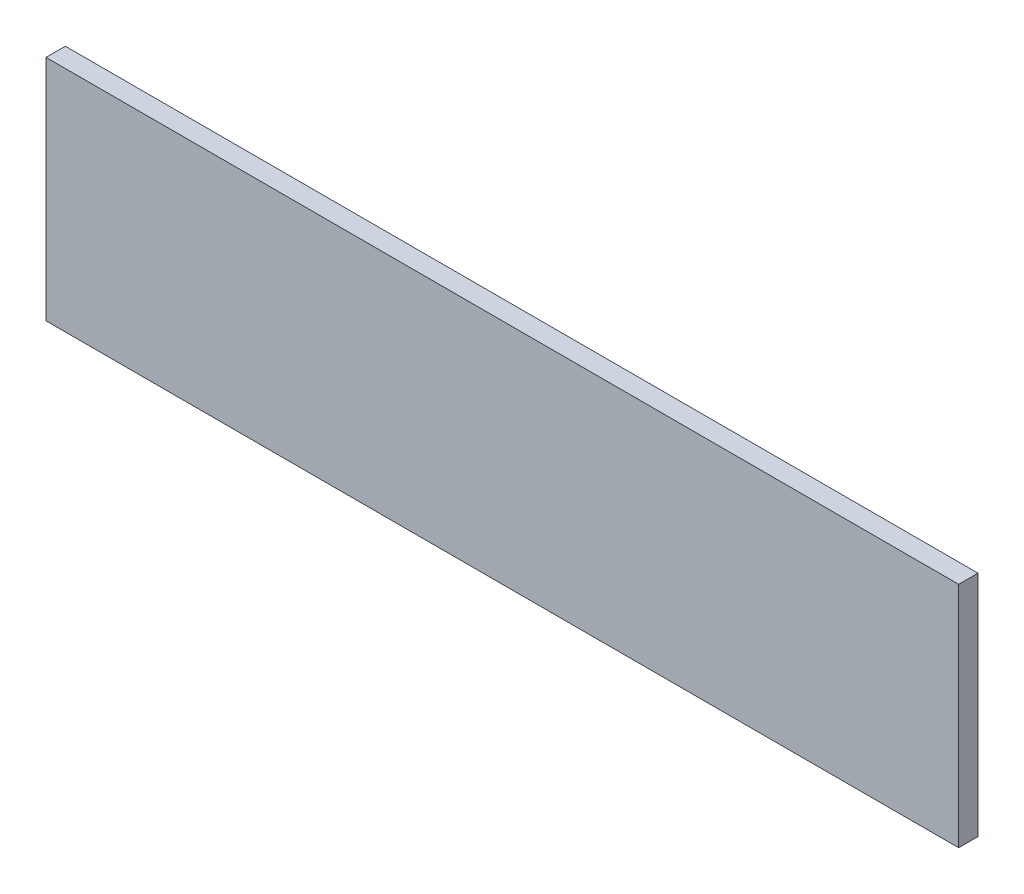
ISO-10303-21;
HEADER;
FILE_DESCRIPTION(('STEP AP214'),'2;1');
FILE_NAME('part.step','',(''),(''),'','','');
FILE_SCHEMA(('AUTOMOTIVE_DESIGN { 1 0 10303 214 1 1 1 1 }'));
ENDSEC;
DATA;
#1=APPLICATION_CONTEXT('core data for automotive mechanical design processes');
#2=APPLICATION_PROTOCOL_DEFINITION('international standard','automotive_design',2000,#1);
#3=PRODUCT_CONTEXT('',#1,'mechanical');
#4=PRODUCT('Part','Part','',(#3));
#5=PRODUCT_RELATED_PRODUCT_CATEGORY('part','',(#4));
#6=PRODUCT_DEFINITION_FORMATION('','',#4);
#7=PRODUCT_DEFINITION_CONTEXT('part definition',#1,'design');
#8=PRODUCT_DEFINITION('design','',#6,#7);
#9=PRODUCT_DEFINITION_SHAPE('','',#8);
#10=(LENGTH_UNIT() NAMED_UNIT(*) SI_UNIT(.MILLI.,.METRE.));
#11=(NAMED_UNIT(*) PLANE_ANGLE_UNIT() SI_UNIT($,.RADIAN.));
#12=(NAMED_UNIT(*) SI_UNIT($,.STERADIAN.) SOLID_ANGLE_UNIT());
#13=UNCERTAINTY_MEASURE_WITH_UNIT(LENGTH_MEASURE(1.E-05),#10,'distance_accuracy_value','');
#14=(GEOMETRIC_REPRESENTATION_CONTEXT(3) GLOBAL_UNCERTAINTY_ASSIGNED_CONTEXT((#13)) GLOBAL_UNIT_ASSIGNED_CONTEXT((#10,
#11,#12)) REPRESENTATION_CONTEXT('',''));
#15=CARTESIAN_POINT('',(0.,0.,0.));
#16=DIRECTION('',(0.,0.,1.));
#17=DIRECTION('',(1.,0.,0.));
#18=AXIS2_PLACEMENT_3D('',#15,#16,#17);
#19=CARTESIAN_POINT('',(300.,-75.,12.7));
#20=DIRECTION('',(-1.,0.,0.));
#21=DIRECTION('',(0.,0.,1.));
#22=AXIS2_PLACEMENT_3D('',#19,#20,#21);
#23=PLANE('',#22);
#24=DIRECTION('',(0.,1.,0.));
#25=VECTOR('',#24,1.);
#26=CARTESIAN_POINT('',(300.,-75.,0.));
#27=LINE('',#26,#25);
#28=CARTESIAN_POINT('',(300.,-75.,0.));
#29=VERTEX_POINT('',#28);
#30=CARTESIAN_POINT('',(300.,75.,0.));
#31=VERTEX_POINT('',#30);
#32=EDGE_CURVE('E96',#29,#31,#27,.T.);
#33=ORIENTED_EDGE('',*,*,#32,.T.);
#34=DIRECTION('',(0.,0.,-1.));
#35=VECTOR('',#34,1.);
#36=CARTESIAN_POINT('',(300.,75.,12.7));
#37=LINE('',#36,#35);
#38=CARTESIAN_POINT('',(300.,75.,12.7));
#39=VERTEX_POINT('',#38);
#40=EDGE_CURVE('E11',#39,#31,#37,.T.);
#41=ORIENTED_EDGE('',*,*,#40,.F.);
#42=DIRECTION('',(0.,1.,0.));
#43=VECTOR('',#42,1.);
#44=CARTESIAN_POINT('',(300.,-75.,12.7));
#45=LINE('',#44,#43);
#46=CARTESIAN_POINT('',(300.,-75.,12.7));
#47=VERTEX_POINT('',#46);
#48=EDGE_CURVE('E84',#47,#39,#45,.T.);
#49=ORIENTED_EDGE('',*,*,#48,.F.);
#50=DIRECTION('',(0.,0.,-1.));
#51=VECTOR('',#50,1.);
#52=CARTESIAN_POINT('',(300.,-75.,12.7));
#53=LINE('',#52,#51);
#54=EDGE_CURVE('E92',#47,#29,#53,.T.);
#55=ORIENTED_EDGE('',*,*,#54,.T.);
#56=EDGE_LOOP('',(#33,#41,#49,#55));
#57=FACE_BOUND('',#56,.T.);
#58=ADVANCED_FACE('F33',(#57),#23,.F.);
#59=CARTESIAN_POINT('',(-300.,75.,12.7));
#60=DIRECTION('',(0.,-1.,0.));
#61=DIRECTION('',(0.,0.,-1.));
#62=AXIS2_PLACEMENT_3D('',#59,#60,#61);
#63=PLANE('',#62);
#64=DIRECTION('',(-1.,0.,0.));
#65=VECTOR('',#64,1.);
#66=CARTESIAN_POINT('',(-300.,75.,0.));
#67=LINE('',#66,#65);
#68=CARTESIAN_POINT('',(-300.,75.,0.));
#69=VERTEX_POINT('',#68);
#70=EDGE_CURVE('E88',#31,#69,#67,.T.);
#71=ORIENTED_EDGE('',*,*,#70,.T.);
#72=DIRECTION('',(0.,0.,-1.));
#73=VECTOR('',#72,1.);
#74=CARTESIAN_POINT('',(-300.,75.,12.7));
#75=LINE('',#74,#73);
#76=CARTESIAN_POINT('',(-300.,75.,12.7));
#77=VERTEX_POINT('',#76);
#78=EDGE_CURVE('E41',#77,#69,#75,.T.);
#79=ORIENTED_EDGE('',*,*,#78,.F.);
#80=DIRECTION('',(-1.,0.,0.));
#81=VECTOR('',#80,1.);
#82=CARTESIAN_POINT('',(-300.,75.,12.7));
#83=LINE('',#82,#81);
#84=EDGE_CURVE('E79',#39,#77,#83,.T.);
#85=ORIENTED_EDGE('',*,*,#84,.F.);
#86=ORIENTED_EDGE('',*,*,#40,.T.);
#87=EDGE_LOOP('',(#71,#79,#85,#86));
#88=FACE_BOUND('',#87,.T.);
#89=ADVANCED_FACE('F87',(#88),#63,.F.);
#90=CARTESIAN_POINT('',(-300.,-75.,12.7));
#91=DIRECTION('',(1.,0.,0.));
#92=DIRECTION('',(0.,0.,-1.));
#93=AXIS2_PLACEMENT_3D('',#90,#91,#92);
#94=PLANE('',#93);
#95=DIRECTION('',(0.,-1.,0.));
#96=VECTOR('',#95,1.);
#97=CARTESIAN_POINT('',(-300.,-75.,0.));
#98=LINE('',#97,#96);
#99=CARTESIAN_POINT('',(-300.,-75.,0.));
#100=VERTEX_POINT('',#99);
#101=EDGE_CURVE('E66',#69,#100,#98,.T.);
#102=ORIENTED_EDGE('',*,*,#101,.T.);
#103=DIRECTION('',(0.,0.,-1.));
#104=VECTOR('',#103,1.);
#105=CARTESIAN_POINT('',(-300.,-75.,12.7));
#106=LINE('',#105,#104);
#107=CARTESIAN_POINT('',(-300.,-75.,12.7));
#108=VERTEX_POINT('',#107);
#109=EDGE_CURVE('E89',#108,#100,#106,.T.);
#110=ORIENTED_EDGE('',*,*,#109,.F.);
#111=DIRECTION('',(0.,-1.,0.));
#112=VECTOR('',#111,1.);
#113=CARTESIAN_POINT('',(-300.,-75.,12.7));
#114=LINE('',#113,#112);
#115=EDGE_CURVE('E82',#77,#108,#114,.T.);
#116=ORIENTED_EDGE('',*,*,#115,.F.);
#117=ORIENTED_EDGE('',*,*,#78,.T.);
#118=EDGE_LOOP('',(#102,#110,#116,#117));
#119=FACE_BOUND('',#118,.T.);
#120=ADVANCED_FACE('F90',(#119),#94,.F.);
#121=CARTESIAN_POINT('',(-300.,-75.,12.7));
#122=DIRECTION('',(0.,1.,0.));
#123=DIRECTION('',(0.,0.,1.));
#124=AXIS2_PLACEMENT_3D('',#121,#122,#123);
#125=PLANE('',#124);
#126=DIRECTION('',(1.,0.,0.));
#127=VECTOR('',#126,1.);
#128=CARTESIAN_POINT('',(-300.,-75.,0.));
#129=LINE('',#128,#127);
#130=EDGE_CURVE('E72',#100,#29,#129,.T.);
#131=ORIENTED_EDGE('',*,*,#130,.T.);
#132=ORIENTED_EDGE('',*,*,#54,.F.);
#133=DIRECTION('',(1.,0.,0.));
#134=VECTOR('',#133,1.);
#135=CARTESIAN_POINT('',(-300.,-75.,12.7));
#136=LINE('',#135,#134);
#137=EDGE_CURVE('E49',#108,#47,#136,.T.);
#138=ORIENTED_EDGE('',*,*,#137,.F.);
#139=ORIENTED_EDGE('',*,*,#109,.T.);
#140=EDGE_LOOP('',(#131,#132,#138,#139));
#141=FACE_BOUND('',#140,.T.);
#142=ADVANCED_FACE('F103',(#141),#125,.F.);
#143=CARTESIAN_POINT('',(0.,0.,12.7));
#144=DIRECTION('',(0.,0.,-1.));
#145=DIRECTION('',(-1.,0.,0.));
#146=AXIS2_PLACEMENT_3D('',#143,#144,#145);
#147=PLANE('',#146);
#148=ORIENTED_EDGE('',*,*,#48,.T.);
#149=ORIENTED_EDGE('',*,*,#84,.T.);
#150=ORIENTED_EDGE('',*,*,#115,.T.);
#151=ORIENTED_EDGE('',*,*,#137,.T.);
#152=EDGE_LOOP('',(#148,#149,#150,#151));
#153=FACE_BOUND('',#152,.T.);
#154=ADVANCED_FACE('F80',(#153),#147,.F.);
#155=CARTESIAN_POINT('',(0.,0.,0.));
#156=DIRECTION('',(0.,0.,-1.));
#157=DIRECTION('',(-1.,0.,0.));
#158=AXIS2_PLACEMENT_3D('',#155,#156,#157);
#159=PLANE('',#158);
#160=ORIENTED_EDGE('',*,*,#32,.F.);
#161=ORIENTED_EDGE('',*,*,#130,.F.);
#162=ORIENTED_EDGE('',*,*,#101,.F.);
#163=ORIENTED_EDGE('',*,*,#70,.F.);
#164=EDGE_LOOP('',(#160,#161,#162,#163));
#165=FACE_BOUND('',#164,.T.);
#166=ADVANCED_FACE('F106',(#165),#159,.T.);
#167=CLOSED_SHELL('',(#58,#89,#120,#142,#154,#166));
#168=MANIFOLD_SOLID_BREP('B2',#167);
#169=ADVANCED_BREP_SHAPE_REPRESENTATION('',(#18,#168),#14);
#170=SHAPE_DEFINITION_REPRESENTATION(#9,#169);
ENDSEC;
END-ISO-10303-21;
